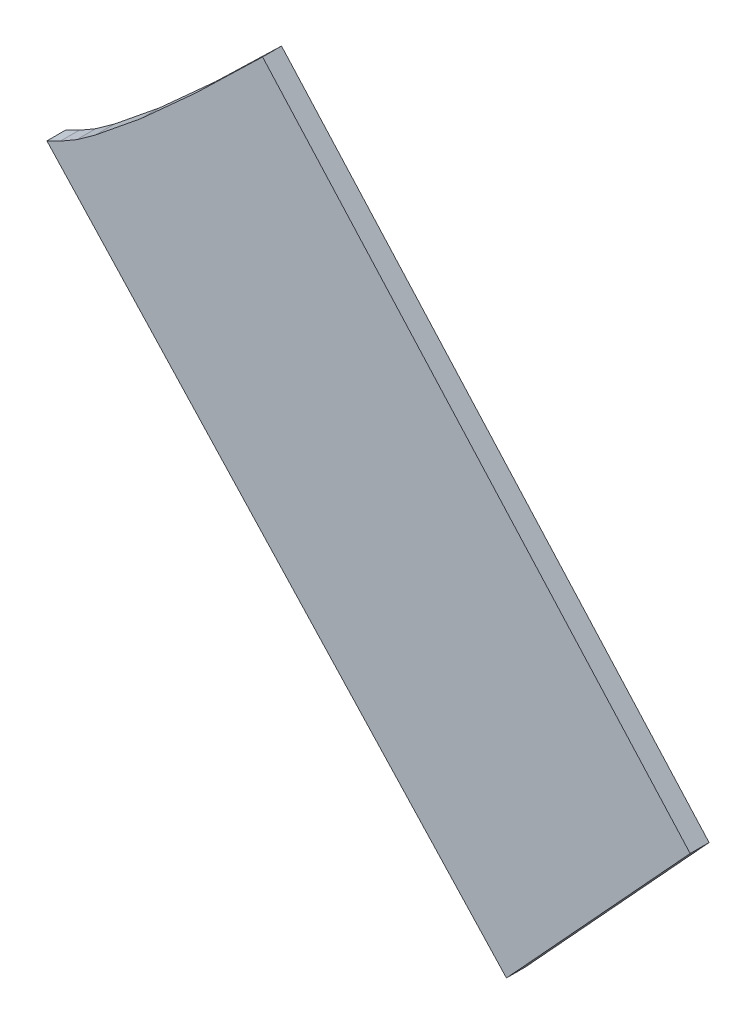
ISO-10303-21;
HEADER;
FILE_DESCRIPTION(('STEP AP214'),'2;1');
FILE_NAME('part.step','',(''),(''),'','','');
FILE_SCHEMA(('AUTOMOTIVE_DESIGN { 1 0 10303 214 1 1 1 1 }'));
ENDSEC;
DATA;
#1=APPLICATION_CONTEXT('core data for automotive mechanical design processes');
#2=APPLICATION_PROTOCOL_DEFINITION('international standard','automotive_design',2000,#1);
#3=PRODUCT_CONTEXT('',#1,'mechanical');
#4=PRODUCT('Part','Part','',(#3));
#5=PRODUCT_RELATED_PRODUCT_CATEGORY('part','',(#4));
#6=PRODUCT_DEFINITION_FORMATION('','',#4);
#7=PRODUCT_DEFINITION_CONTEXT('part definition',#1,'design');
#8=PRODUCT_DEFINITION('design','',#6,#7);
#9=PRODUCT_DEFINITION_SHAPE('','',#8);
#10=(LENGTH_UNIT() NAMED_UNIT(*) SI_UNIT(.MILLI.,.METRE.));
#11=(NAMED_UNIT(*) PLANE_ANGLE_UNIT() SI_UNIT($,.RADIAN.));
#12=(NAMED_UNIT(*) SI_UNIT($,.STERADIAN.) SOLID_ANGLE_UNIT());
#13=UNCERTAINTY_MEASURE_WITH_UNIT(LENGTH_MEASURE(1.E-05),#10,'distance_accuracy_value','');
#14=(GEOMETRIC_REPRESENTATION_CONTEXT(3) GLOBAL_UNCERTAINTY_ASSIGNED_CONTEXT((#13)) GLOBAL_UNIT_ASSIGNED_CONTEXT((#10,
#11,#12)) REPRESENTATION_CONTEXT('',''));
#15=CARTESIAN_POINT('',(0.,0.,0.));
#16=DIRECTION('',(0.,0.,1.));
#17=DIRECTION('',(1.,0.,0.));
#18=AXIS2_PLACEMENT_3D('',#15,#16,#17);
#19=CARTESIAN_POINT('',(38.7309989929199,47.1790008544922,0.));
#20=DIRECTION('',(0.695428055889778,-0.718595727152175,0.));
#21=DIRECTION('',(-0.718595727152175,-0.695428055889778,0.));
#22=AXIS2_PLACEMENT_3D('',#19,#20,#21);
#23=PLANE('',#22);
#24=DIRECTION('',(-0.718595727152175,-0.695428055889778,0.));
#25=VECTOR('',#24,1.);
#26=CARTESIAN_POINT('',(38.7309989929199,47.1790008544922,0.03556));
#27=LINE('',#26,#25);
#28=CARTESIAN_POINT('',(38.7309989929199,47.1790008544922,0.03556));
#29=VERTEX_POINT('',#28);
#30=CARTESIAN_POINT('',(38.6069984436035,47.0589981079102,0.03556));
#31=VERTEX_POINT('',#30);
#32=EDGE_CURVE('E11',#29,#31,#27,.T.);
#33=ORIENTED_EDGE('',*,*,#32,.F.);
#34=DIRECTION('',(0.,0.,1.));
#35=VECTOR('',#34,1.);
#36=CARTESIAN_POINT('',(38.7309989929199,47.1790008544922,0.));
#37=LINE('',#36,#35);
#38=CARTESIAN_POINT('',(38.7309989929199,47.1790008544922,0.));
#39=VERTEX_POINT('',#38);
#40=EDGE_CURVE('E24',#39,#29,#37,.T.);
#41=ORIENTED_EDGE('',*,*,#40,.F.);
#42=DIRECTION('',(-0.718595727152175,-0.695428055889778,0.));
#43=VECTOR('',#42,1.);
#44=CARTESIAN_POINT('',(38.7309989929199,47.1790008544922,0.));
#45=LINE('',#44,#43);
#46=CARTESIAN_POINT('',(38.6069984436035,47.0589981079102,0.));
#47=VERTEX_POINT('',#46);
#48=EDGE_CURVE('E106',#39,#47,#45,.T.);
#49=ORIENTED_EDGE('',*,*,#48,.T.);
#50=DIRECTION('',(0.,0.,1.));
#51=VECTOR('',#50,1.);
#52=CARTESIAN_POINT('',(38.6069984436035,47.0589981079102,0.));
#53=LINE('',#52,#51);
#54=EDGE_CURVE('E37',#47,#31,#53,.T.);
#55=ORIENTED_EDGE('',*,*,#54,.T.);
#56=EDGE_LOOP('',(#33,#41,#49,#55));
#57=FACE_BOUND('',#56,.T.);
#58=ADVANCED_FACE('F17',(#57),#23,.F.);
#59=CARTESIAN_POINT('',(38.6069984436035,47.0589981079102,0.));
#60=DIRECTION('',(0.670904858760149,-0.741543438034498,0.));
#61=DIRECTION('',(-0.741543438034498,-0.670904858760149,0.));
#62=AXIS2_PLACEMENT_3D('',#59,#60,#61);
#63=PLANE('',#62);
#64=DIRECTION('',(-0.741543438034498,-0.670904858760149,0.));
#65=VECTOR('',#64,1.);
#66=CARTESIAN_POINT('',(38.6069984436035,47.0589981079102,0.03556));
#67=LINE('',#66,#65);
#68=CARTESIAN_POINT('',(38.5019989013672,46.9640007019043,0.03556));
#69=VERTEX_POINT('',#68);
#70=EDGE_CURVE('E154',#31,#69,#67,.T.);
#71=ORIENTED_EDGE('',*,*,#70,.F.);
#72=ORIENTED_EDGE('',*,*,#54,.F.);
#73=DIRECTION('',(-0.741543438034498,-0.670904858760149,0.));
#74=VECTOR('',#73,1.);
#75=CARTESIAN_POINT('',(38.6069984436035,47.0589981079102,0.));
#76=LINE('',#75,#74);
#77=CARTESIAN_POINT('',(38.5019989013672,46.9640007019043,0.));
#78=VERTEX_POINT('',#77);
#79=EDGE_CURVE('E151',#47,#78,#76,.T.);
#80=ORIENTED_EDGE('',*,*,#79,.T.);
#81=DIRECTION('',(0.,0.,1.));
#82=VECTOR('',#81,1.);
#83=CARTESIAN_POINT('',(38.5019989013672,46.9640007019043,0.));
#84=LINE('',#83,#82);
#85=EDGE_CURVE('E149',#78,#69,#84,.T.);
#86=ORIENTED_EDGE('',*,*,#85,.T.);
#87=EDGE_LOOP('',(#71,#72,#80,#86));
#88=FACE_BOUND('',#87,.T.);
#89=ADVANCED_FACE('F162',(#88),#63,.F.);
#90=CARTESIAN_POINT('',(38.5019989013672,46.9640007019043,0.));
#91=DIRECTION('',(0.630254129642275,-0.776388905168575,0.));
#92=DIRECTION('',(-0.776388905168575,-0.630254129642275,0.));
#93=AXIS2_PLACEMENT_3D('',#90,#91,#92);
#94=PLANE('',#93);
#95=DIRECTION('',(-0.776388905168575,-0.630254129642275,0.));
#96=VECTOR('',#95,1.);
#97=CARTESIAN_POINT('',(38.5019989013672,46.9640007019043,0.03556));
#98=LINE('',#97,#96);
#99=CARTESIAN_POINT('',(38.4169998168945,46.8950004577637,0.03556));
#100=VERTEX_POINT('',#99);
#101=EDGE_CURVE('E146',#69,#100,#98,.T.);
#102=ORIENTED_EDGE('',*,*,#101,.F.);
#103=ORIENTED_EDGE('',*,*,#85,.F.);
#104=DIRECTION('',(-0.776388905168575,-0.630254129642275,0.));
#105=VECTOR('',#104,1.);
#106=CARTESIAN_POINT('',(38.5019989013672,46.9640007019043,0.));
#107=LINE('',#106,#105);
#108=CARTESIAN_POINT('',(38.4169998168945,46.8950004577637,0.));
#109=VERTEX_POINT('',#108);
#110=EDGE_CURVE('E143',#78,#109,#107,.T.);
#111=ORIENTED_EDGE('',*,*,#110,.T.);
#112=DIRECTION('',(0.,0.,1.));
#113=VECTOR('',#112,1.);
#114=CARTESIAN_POINT('',(38.4169998168945,46.8950004577637,0.));
#115=LINE('',#114,#113);
#116=EDGE_CURVE('E141',#109,#100,#115,.T.);
#117=ORIENTED_EDGE('',*,*,#116,.T.);
#118=EDGE_LOOP('',(#102,#103,#111,#117));
#119=FACE_BOUND('',#118,.T.);
#120=ADVANCED_FACE('F168',(#119),#94,.F.);
#121=CARTESIAN_POINT('',(38.4169998168945,46.8950004577637,0.));
#122=DIRECTION('',(0.581263361752979,-0.813715493451873,0.));
#123=DIRECTION('',(-0.813715493451873,-0.581263361752979,0.));
#124=AXIS2_PLACEMENT_3D('',#121,#122,#123);
#125=PLANE('',#124);
#126=DIRECTION('',(-0.813715493451873,-0.581263361752979,0.));
#127=VECTOR('',#126,1.);
#128=CARTESIAN_POINT('',(38.4169998168945,46.8950004577637,0.03556));
#129=LINE('',#128,#127);
#130=CARTESIAN_POINT('',(38.3819999694824,46.8699989318848,0.03556));
#131=VERTEX_POINT('',#130);
#132=EDGE_CURVE('E138',#100,#131,#129,.T.);
#133=ORIENTED_EDGE('',*,*,#132,.F.);
#134=ORIENTED_EDGE('',*,*,#116,.F.);
#135=DIRECTION('',(-0.813715493451873,-0.581263361752979,0.));
#136=VECTOR('',#135,1.);
#137=CARTESIAN_POINT('',(38.4169998168945,46.8950004577637,0.));
#138=LINE('',#137,#136);
#139=CARTESIAN_POINT('',(38.3819999694824,46.8699989318848,0.));
#140=VERTEX_POINT('',#139);
#141=EDGE_CURVE('E135',#109,#140,#138,.T.);
#142=ORIENTED_EDGE('',*,*,#141,.T.);
#143=DIRECTION('',(0.,0.,1.));
#144=VECTOR('',#143,1.);
#145=CARTESIAN_POINT('',(38.3819999694824,46.8699989318848,0.));
#146=LINE('',#145,#144);
#147=EDGE_CURVE('E133',#140,#131,#146,.T.);
#148=ORIENTED_EDGE('',*,*,#147,.T.);
#149=EDGE_LOOP('',(#133,#134,#142,#148));
#150=FACE_BOUND('',#149,.T.);
#151=ADVANCED_FACE('F170',(#150),#125,.F.);
#152=CARTESIAN_POINT('',(38.3819999694824,46.8699989318848,0.));
#153=DIRECTION('',(0.502109842820697,-0.864803853912883,0.));
#154=DIRECTION('',(-0.864803853912883,-0.502109842820697,0.));
#155=AXIS2_PLACEMENT_3D('',#152,#153,#154);
#156=PLANE('',#155);
#157=DIRECTION('',(-0.864803853912883,-0.502109842820697,0.));
#158=VECTOR('',#157,1.);
#159=CARTESIAN_POINT('',(38.3819999694824,46.8699989318848,0.03556));
#160=LINE('',#159,#158);
#161=CARTESIAN_POINT('',(38.351001739502,46.8520011901855,0.03556));
#162=VERTEX_POINT('',#161);
#163=EDGE_CURVE('E130',#131,#162,#160,.T.);
#164=ORIENTED_EDGE('',*,*,#163,.F.);
#165=ORIENTED_EDGE('',*,*,#147,.F.);
#166=DIRECTION('',(-0.864803853912883,-0.502109842820697,0.));
#167=VECTOR('',#166,1.);
#168=CARTESIAN_POINT('',(38.3819999694824,46.8699989318848,0.));
#169=LINE('',#168,#167);
#170=CARTESIAN_POINT('',(38.351001739502,46.8520011901855,0.));
#171=VERTEX_POINT('',#170);
#172=EDGE_CURVE('E127',#140,#171,#169,.T.);
#173=ORIENTED_EDGE('',*,*,#172,.T.);
#174=DIRECTION('',(0.,0.,1.));
#175=VECTOR('',#174,1.);
#176=CARTESIAN_POINT('',(38.351001739502,46.8520011901855,0.));
#177=LINE('',#176,#175);
#178=EDGE_CURVE('E125',#171,#162,#177,.T.);
#179=ORIENTED_EDGE('',*,*,#178,.T.);
#180=EDGE_LOOP('',(#164,#165,#173,#179));
#181=FACE_BOUND('',#180,.T.);
#182=ADVANCED_FACE('F175',(#181),#156,.F.);
#183=CARTESIAN_POINT('',(38.351001739502,46.8520011901855,0.));
#184=DIRECTION('',(0.432740011155876,-0.901518764499559,0.));
#185=DIRECTION('',(-0.901518764499559,-0.432740011155876,0.));
#186=AXIS2_PLACEMENT_3D('',#183,#184,#185);
#187=PLANE('',#186);
#188=DIRECTION('',(-0.901518764499559,-0.432740011155876,0.));
#189=VECTOR('',#188,1.);
#190=CARTESIAN_POINT('',(38.351001739502,46.8520011901855,0.03556));
#191=LINE('',#190,#189);
#192=CARTESIAN_POINT('',(38.326000213623,46.8400001525879,0.03556));
#193=VERTEX_POINT('',#192);
#194=EDGE_CURVE('E122',#162,#193,#191,.T.);
#195=ORIENTED_EDGE('',*,*,#194,.F.);
#196=ORIENTED_EDGE('',*,*,#178,.F.);
#197=DIRECTION('',(-0.901518764499559,-0.432740011155876,0.));
#198=VECTOR('',#197,1.);
#199=CARTESIAN_POINT('',(38.351001739502,46.8520011901855,0.));
#200=LINE('',#199,#198);
#201=CARTESIAN_POINT('',(38.326000213623,46.8400001525879,0.));
#202=VERTEX_POINT('',#201);
#203=EDGE_CURVE('E119',#171,#202,#200,.T.);
#204=ORIENTED_EDGE('',*,*,#203,.T.);
#205=DIRECTION('',(0.,0.,1.));
#206=VECTOR('',#205,1.);
#207=CARTESIAN_POINT('',(38.326000213623,46.8400001525879,0.));
#208=LINE('',#207,#206);
#209=EDGE_CURVE('E117',#202,#193,#208,.T.);
#210=ORIENTED_EDGE('',*,*,#209,.T.);
#211=EDGE_LOOP('',(#195,#196,#204,#210));
#212=FACE_BOUND('',#211,.T.);
#213=ADVANCED_FACE('F178',(#212),#187,.F.);
#214=CARTESIAN_POINT('',(38.326000213623,46.8400001525879,0.));
#215=DIRECTION('',(0.733018551352128,0.680208646941237,0.));
#216=DIRECTION('',(0.680208646941237,-0.733018551352128,0.));
#217=AXIS2_PLACEMENT_3D('',#214,#215,#216);
#218=PLANE('',#217);
#219=DIRECTION('',(0.680208646941237,-0.733018551352128,0.));
#220=VECTOR('',#219,1.);
#221=CARTESIAN_POINT('',(38.326000213623,46.8400001525879,0.03556));
#222=LINE('',#221,#220);
#223=CARTESIAN_POINT('',(39.1889991760254,45.9099998474121,0.03556));
#224=VERTEX_POINT('',#223);
#225=EDGE_CURVE('E114',#193,#224,#222,.T.);
#226=ORIENTED_EDGE('',*,*,#225,.F.);
#227=ORIENTED_EDGE('',*,*,#209,.F.);
#228=DIRECTION('',(0.680208646941237,-0.733018551352128,0.));
#229=VECTOR('',#228,1.);
#230=CARTESIAN_POINT('',(38.326000213623,46.8400001525879,0.));
#231=LINE('',#230,#229);
#232=CARTESIAN_POINT('',(39.1889991760254,45.9099998474121,0.));
#233=VERTEX_POINT('',#232);
#234=EDGE_CURVE('E112',#202,#233,#231,.T.);
#235=ORIENTED_EDGE('',*,*,#234,.T.);
#236=DIRECTION('',(0.,0.,1.));
#237=VECTOR('',#236,1.);
#238=CARTESIAN_POINT('',(39.1889991760254,45.9099998474121,0.));
#239=LINE('',#238,#237);
#240=EDGE_CURVE('E97',#233,#224,#239,.T.);
#241=ORIENTED_EDGE('',*,*,#240,.T.);
#242=EDGE_LOOP('',(#226,#227,#235,#241));
#243=FACE_BOUND('',#242,.T.);
#244=ADVANCED_FACE('F181',(#243),#218,.F.);
#245=CARTESIAN_POINT('',(39.1889991760254,45.9099998474121,0.));
#246=DIRECTION('',(-0.735929818110076,0.677057828266147,0.));
#247=DIRECTION('',(0.677057828266147,0.735929818110076,0.));
#248=AXIS2_PLACEMENT_3D('',#245,#246,#247);
#249=PLANE('',#248);
#250=DIRECTION('',(0.677057828266146,0.735929818110076,0.));
#251=VECTOR('',#250,1.);
#252=CARTESIAN_POINT('',(39.1889991760254,45.9099998474121,0.03556));
#253=LINE('',#252,#251);
#254=CARTESIAN_POINT('',(39.5340003967285,46.2849998474121,0.03556));
#255=VERTEX_POINT('',#254);
#256=EDGE_CURVE('E101',#224,#255,#253,.T.);
#257=ORIENTED_EDGE('',*,*,#256,.F.);
#258=ORIENTED_EDGE('',*,*,#240,.F.);
#259=DIRECTION('',(0.677057828266146,0.735929818110076,0.));
#260=VECTOR('',#259,1.);
#261=CARTESIAN_POINT('',(39.1889991760254,45.9099998474121,0.));
#262=LINE('',#261,#260);
#263=CARTESIAN_POINT('',(39.5340003967285,46.2849998474121,0.));
#264=VERTEX_POINT('',#263);
#265=EDGE_CURVE('E93',#233,#264,#262,.T.);
#266=ORIENTED_EDGE('',*,*,#265,.T.);
#267=DIRECTION('',(0.,0.,1.));
#268=VECTOR('',#267,1.);
#269=CARTESIAN_POINT('',(39.5340003967285,46.2849998474121,0.));
#270=LINE('',#269,#268);
#271=EDGE_CURVE('E83',#264,#255,#270,.T.);
#272=ORIENTED_EDGE('',*,*,#271,.T.);
#273=EDGE_LOOP('',(#257,#258,#266,#272));
#274=FACE_BOUND('',#273,.T.);
#275=ADVANCED_FACE('F96',(#274),#249,.F.);
#276=CARTESIAN_POINT('',(39.5340003967285,46.2849998474121,0.));
#277=DIRECTION('',(-0.74395562991867,-0.668229018160925,0.));
#278=DIRECTION('',(-0.668229018160925,0.74395562991867,0.));
#279=AXIS2_PLACEMENT_3D('',#276,#277,#278);
#280=PLANE('',#279);
#281=DIRECTION('',(-0.668229018160925,0.74395562991867,0.));
#282=VECTOR('',#281,1.);
#283=CARTESIAN_POINT('',(39.5340003967285,46.2849998474121,0.03556));
#284=LINE('',#283,#282);
#285=EDGE_CURVE('E89',#255,#29,#284,.T.);
#286=ORIENTED_EDGE('',*,*,#285,.F.);
#287=ORIENTED_EDGE('',*,*,#271,.F.);
#288=DIRECTION('',(-0.668229018160925,0.74395562991867,0.));
#289=VECTOR('',#288,1.);
#290=CARTESIAN_POINT('',(39.5340003967285,46.2849998474121,0.));
#291=LINE('',#290,#289);
#292=EDGE_CURVE('E87',#264,#39,#291,.T.);
#293=ORIENTED_EDGE('',*,*,#292,.T.);
#294=ORIENTED_EDGE('',*,*,#40,.T.);
#295=EDGE_LOOP('',(#286,#287,#293,#294));
#296=FACE_BOUND('',#295,.T.);
#297=ADVANCED_FACE('F85',(#296),#280,.F.);
#298=CARTESIAN_POINT('',(38.7309989929199,47.1790008544922,0.));
#299=DIRECTION('',(0.,0.,1.));
#300=DIRECTION('',(1.,0.,0.));
#301=AXIS2_PLACEMENT_3D('',#298,#299,#300);
#302=PLANE('',#301);
#303=ORIENTED_EDGE('',*,*,#292,.F.);
#304=ORIENTED_EDGE('',*,*,#265,.F.);
#305=ORIENTED_EDGE('',*,*,#234,.F.);
#306=ORIENTED_EDGE('',*,*,#203,.F.);
#307=ORIENTED_EDGE('',*,*,#172,.F.);
#308=ORIENTED_EDGE('',*,*,#141,.F.);
#309=ORIENTED_EDGE('',*,*,#110,.F.);
#310=ORIENTED_EDGE('',*,*,#79,.F.);
#311=ORIENTED_EDGE('',*,*,#48,.F.);
#312=EDGE_LOOP('',(#303,#304,#305,#306,#307,#308,#309,#310,#311));
#313=FACE_BOUND('',#312,.T.);
#314=ADVANCED_FACE('F104',(#313),#302,.F.);
#315=CARTESIAN_POINT('',(38.7309989929199,47.1790008544922,0.03556));
#316=DIRECTION('',(0.,0.,1.));
#317=DIRECTION('',(1.,0.,0.));
#318=AXIS2_PLACEMENT_3D('',#315,#316,#317);
#319=PLANE('',#318);
#320=ORIENTED_EDGE('',*,*,#32,.T.);
#321=ORIENTED_EDGE('',*,*,#70,.T.);
#322=ORIENTED_EDGE('',*,*,#101,.T.);
#323=ORIENTED_EDGE('',*,*,#132,.T.);
#324=ORIENTED_EDGE('',*,*,#163,.T.);
#325=ORIENTED_EDGE('',*,*,#194,.T.);
#326=ORIENTED_EDGE('',*,*,#225,.T.);
#327=ORIENTED_EDGE('',*,*,#256,.T.);
#328=ORIENTED_EDGE('',*,*,#285,.T.);
#329=EDGE_LOOP('',(#320,#321,#322,#323,#324,#325,#326,#327,#328));
#330=FACE_BOUND('',#329,.T.);
#331=ADVANCED_FACE('F165',(#330),#319,.T.);
#332=CLOSED_SHELL('',(#58,#89,#120,#151,#182,#213,#244,#275,#297,#314,#331));
#333=MANIFOLD_SOLID_BREP('B1',#332);
#334=ADVANCED_BREP_SHAPE_REPRESENTATION('',(#18,#333),#14);
#335=SHAPE_DEFINITION_REPRESENTATION(#9,#334);
ENDSEC;
END-ISO-10303-21;
